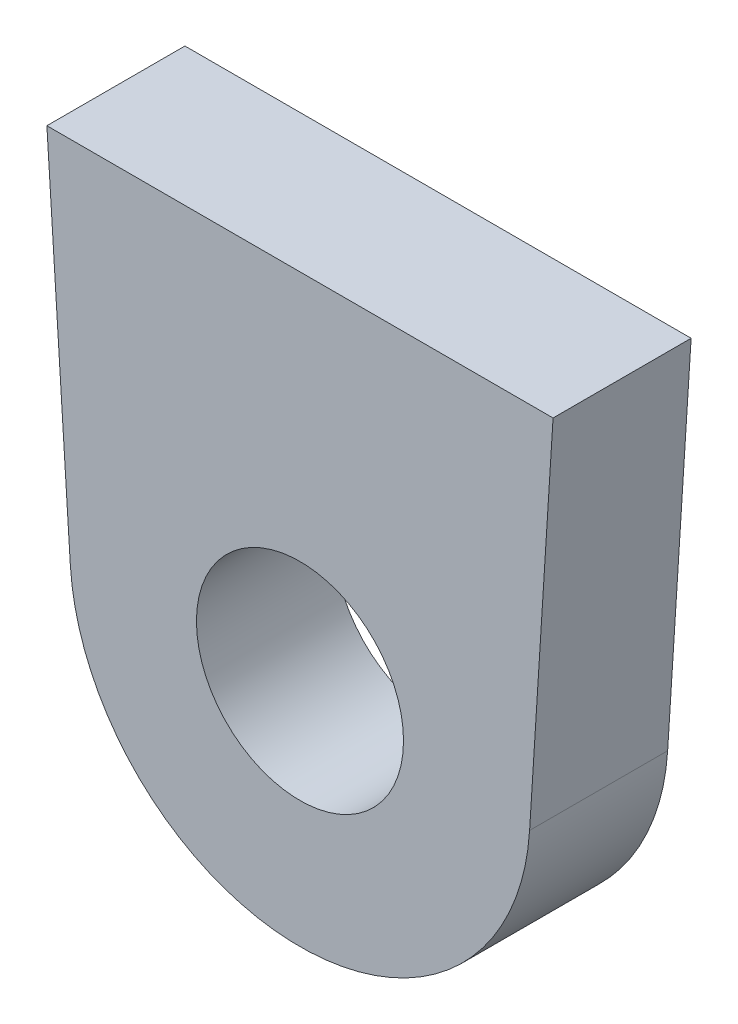
ISO-10303-21;
HEADER;
FILE_DESCRIPTION(('STEP AP214'),'2;1');
FILE_NAME('part.step','',(''),(''),'','','');
FILE_SCHEMA(('AUTOMOTIVE_DESIGN { 1 0 10303 214 1 1 1 1 }'));
ENDSEC;
DATA;
#1=APPLICATION_CONTEXT('core data for automotive mechanical design processes');
#2=APPLICATION_PROTOCOL_DEFINITION('international standard','automotive_design',2000,#1);
#3=PRODUCT_CONTEXT('',#1,'mechanical');
#4=PRODUCT('Part','Part','',(#3));
#5=PRODUCT_RELATED_PRODUCT_CATEGORY('part','',(#4));
#6=PRODUCT_DEFINITION_FORMATION('','',#4);
#7=PRODUCT_DEFINITION_CONTEXT('part definition',#1,'design');
#8=PRODUCT_DEFINITION('design','',#6,#7);
#9=PRODUCT_DEFINITION_SHAPE('','',#8);
#10=(LENGTH_UNIT() NAMED_UNIT(*) SI_UNIT(.MILLI.,.METRE.));
#11=(NAMED_UNIT(*) PLANE_ANGLE_UNIT() SI_UNIT($,.RADIAN.));
#12=(NAMED_UNIT(*) SI_UNIT($,.STERADIAN.) SOLID_ANGLE_UNIT());
#13=UNCERTAINTY_MEASURE_WITH_UNIT(LENGTH_MEASURE(1.E-05),#10,'distance_accuracy_value','');
#14=(GEOMETRIC_REPRESENTATION_CONTEXT(3) GLOBAL_UNCERTAINTY_ASSIGNED_CONTEXT((#13)) GLOBAL_UNIT_ASSIGNED_CONTEXT((#10,
#11,#12)) REPRESENTATION_CONTEXT('',''));
#15=CARTESIAN_POINT('',(0.,0.,0.));
#16=DIRECTION('',(0.,0.,1.));
#17=DIRECTION('',(1.,0.,0.));
#18=AXIS2_PLACEMENT_3D('',#15,#16,#17);
#19=CARTESIAN_POINT('',(0.,0.,30.));
#20=DIRECTION('',(0.,0.,1.));
#21=DIRECTION('',(1.,0.,0.));
#22=AXIS2_PLACEMENT_3D('',#19,#20,#21);
#23=PLANE('',#22);
#24=DIRECTION('',(0.0634938026632661,-0.997982232819482,0.));
#25=VECTOR('',#24,1.);
#26=CARTESIAN_POINT('',(-55.,77.,30.));
#27=LINE('',#26,#25);
#28=CARTESIAN_POINT('',(-55.,77.,30.));
#29=VERTEX_POINT('',#28);
#30=CARTESIAN_POINT('',(-49.8991116409741,-3.17469013316329,30.));
#31=VERTEX_POINT('',#30);
#32=EDGE_CURVE('E87',#29,#31,#27,.T.);
#33=ORIENTED_EDGE('',*,*,#32,.T.);
#34=CARTESIAN_POINT('',(0.,0.,30.));
#35=DIRECTION('',(0.,0.,1.));
#36=DIRECTION('',(1.,0.,0.));
#37=AXIS2_PLACEMENT_3D('',#34,#35,#36);
#38=CIRCLE('',#37,50.);
#39=CARTESIAN_POINT('',(49.8991116409741,-3.17469013316331,30.));
#40=VERTEX_POINT('',#39);
#41=EDGE_CURVE('E82',#31,#40,#38,.T.);
#42=ORIENTED_EDGE('',*,*,#41,.T.);
#43=DIRECTION('',(0.0634938026632661,0.997982232819482,0.));
#44=VECTOR('',#43,1.);
#45=CARTESIAN_POINT('',(55.,77.,30.));
#46=LINE('',#45,#44);
#47=CARTESIAN_POINT('',(55.,77.,30.));
#48=VERTEX_POINT('',#47);
#49=EDGE_CURVE('E85',#40,#48,#46,.T.);
#50=ORIENTED_EDGE('',*,*,#49,.T.);
#51=DIRECTION('',(-1.,0.,0.));
#52=VECTOR('',#51,1.);
#53=CARTESIAN_POINT('',(-55.,77.,30.));
#54=LINE('',#53,#52);
#55=EDGE_CURVE('E52',#48,#29,#54,.T.);
#56=ORIENTED_EDGE('',*,*,#55,.T.);
#57=EDGE_LOOP('',(#33,#42,#50,#56));
#58=FACE_BOUND('',#57,.T.);
#59=CARTESIAN_POINT('',(0.,0.,30.));
#60=DIRECTION('',(0.,0.,1.));
#61=DIRECTION('',(1.,0.,0.));
#62=AXIS2_PLACEMENT_3D('',#59,#60,#61);
#63=CIRCLE('',#62,22.5);
#64=CARTESIAN_POINT('',(22.5,0.,30.));
#65=VERTEX_POINT('',#64);
#66=EDGE_CURVE('E102',#65,#65,#63,.T.);
#67=ORIENTED_EDGE('',*,*,#66,.F.);
#68=EDGE_LOOP('',(#67));
#69=FACE_BOUND('',#68,.T.);
#70=ADVANCED_FACE('F35',(#58,#69),#23,.T.);
#71=CARTESIAN_POINT('',(0.,0.,0.));
#72=DIRECTION('',(0.,0.,1.));
#73=DIRECTION('',(1.,0.,0.));
#74=AXIS2_PLACEMENT_3D('',#71,#72,#73);
#75=PLANE('',#74);
#76=DIRECTION('',(0.0634938026632661,-0.997982232819482,0.));
#77=VECTOR('',#76,1.);
#78=CARTESIAN_POINT('',(-55.,77.,0.));
#79=LINE('',#78,#77);
#80=CARTESIAN_POINT('',(-55.,77.,0.));
#81=VERTEX_POINT('',#80);
#82=CARTESIAN_POINT('',(-49.8991116409741,-3.17469013316329,0.));
#83=VERTEX_POINT('',#82);
#84=EDGE_CURVE('E99',#81,#83,#79,.T.);
#85=ORIENTED_EDGE('',*,*,#84,.F.);
#86=DIRECTION('',(-1.,0.,0.));
#87=VECTOR('',#86,1.);
#88=CARTESIAN_POINT('',(-55.,77.,0.));
#89=LINE('',#88,#87);
#90=CARTESIAN_POINT('',(55.,77.,0.));
#91=VERTEX_POINT('',#90);
#92=EDGE_CURVE('E75',#91,#81,#89,.T.);
#93=ORIENTED_EDGE('',*,*,#92,.F.);
#94=DIRECTION('',(0.0634938026632661,0.997982232819482,0.));
#95=VECTOR('',#94,1.);
#96=CARTESIAN_POINT('',(55.,77.,0.));
#97=LINE('',#96,#95);
#98=CARTESIAN_POINT('',(49.8991116409741,-3.17469013316331,0.));
#99=VERTEX_POINT('',#98);
#100=EDGE_CURVE('E69',#99,#91,#97,.T.);
#101=ORIENTED_EDGE('',*,*,#100,.F.);
#102=CARTESIAN_POINT('',(0.,0.,0.));
#103=DIRECTION('',(0.,0.,1.));
#104=DIRECTION('',(1.,0.,0.));
#105=AXIS2_PLACEMENT_3D('',#102,#103,#104);
#106=CIRCLE('',#105,50.);
#107=EDGE_CURVE('E91',#83,#99,#106,.T.);
#108=ORIENTED_EDGE('',*,*,#107,.F.);
#109=EDGE_LOOP('',(#85,#93,#101,#108));
#110=FACE_BOUND('',#109,.T.);
#111=CARTESIAN_POINT('',(0.,0.,0.));
#112=DIRECTION('',(0.,0.,1.));
#113=DIRECTION('',(1.,0.,0.));
#114=AXIS2_PLACEMENT_3D('',#111,#112,#113);
#115=CIRCLE('',#114,22.5);
#116=CARTESIAN_POINT('',(22.5,0.,0.));
#117=VERTEX_POINT('',#116);
#118=EDGE_CURVE('E114',#117,#117,#115,.T.);
#119=ORIENTED_EDGE('',*,*,#118,.T.);
#120=EDGE_LOOP('',(#119));
#121=FACE_BOUND('',#120,.T.);
#122=ADVANCED_FACE('F110',(#110,#121),#75,.F.);
#123=CARTESIAN_POINT('',(-55.,77.,30.));
#124=DIRECTION('',(0.997982232819482,0.0634938026632661,0.));
#125=DIRECTION('',(-0.0634938026632661,0.997982232819482,0.));
#126=AXIS2_PLACEMENT_3D('',#123,#124,#125);
#127=PLANE('',#126);
#128=ORIENTED_EDGE('',*,*,#84,.T.);
#129=DIRECTION('',(0.,0.,-1.));
#130=VECTOR('',#129,1.);
#131=CARTESIAN_POINT('',(-49.8991116409741,-3.17469013316329,30.));
#132=LINE('',#131,#130);
#133=EDGE_CURVE('E11',#31,#83,#132,.T.);
#134=ORIENTED_EDGE('',*,*,#133,.F.);
#135=ORIENTED_EDGE('',*,*,#32,.F.);
#136=DIRECTION('',(0.,0.,-1.));
#137=VECTOR('',#136,1.);
#138=CARTESIAN_POINT('',(-55.,77.,30.));
#139=LINE('',#138,#137);
#140=EDGE_CURVE('E95',#29,#81,#139,.T.);
#141=ORIENTED_EDGE('',*,*,#140,.T.);
#142=EDGE_LOOP('',(#128,#134,#135,#141));
#143=FACE_BOUND('',#142,.T.);
#144=ADVANCED_FACE('F37',(#143),#127,.F.);
#145=CARTESIAN_POINT('',(0.,0.,30.));
#146=DIRECTION('',(0.,0.,-1.));
#147=DIRECTION('',(-1.,0.,0.));
#148=AXIS2_PLACEMENT_3D('',#145,#146,#147);
#149=CYLINDRICAL_SURFACE('',#148,50.);
#150=ORIENTED_EDGE('',*,*,#107,.T.);
#151=DIRECTION('',(0.,0.,-1.));
#152=VECTOR('',#151,1.);
#153=CARTESIAN_POINT('',(49.8991116409741,-3.17469013316331,30.));
#154=LINE('',#153,#152);
#155=EDGE_CURVE('E44',#40,#99,#154,.T.);
#156=ORIENTED_EDGE('',*,*,#155,.F.);
#157=ORIENTED_EDGE('',*,*,#41,.F.);
#158=ORIENTED_EDGE('',*,*,#133,.T.);
#159=EDGE_LOOP('',(#150,#156,#157,#158));
#160=FACE_BOUND('',#159,.T.);
#161=ADVANCED_FACE('F90',(#160),#149,.T.);
#162=CARTESIAN_POINT('',(55.,77.,30.));
#163=DIRECTION('',(-0.997982232819482,0.0634938026632661,0.));
#164=DIRECTION('',(-0.0634938026632661,-0.997982232819482,0.));
#165=AXIS2_PLACEMENT_3D('',#162,#163,#164);
#166=PLANE('',#165);
#167=ORIENTED_EDGE('',*,*,#100,.T.);
#168=DIRECTION('',(0.,0.,-1.));
#169=VECTOR('',#168,1.);
#170=CARTESIAN_POINT('',(55.,77.,30.));
#171=LINE('',#170,#169);
#172=EDGE_CURVE('E92',#48,#91,#171,.T.);
#173=ORIENTED_EDGE('',*,*,#172,.F.);
#174=ORIENTED_EDGE('',*,*,#49,.F.);
#175=ORIENTED_EDGE('',*,*,#155,.T.);
#176=EDGE_LOOP('',(#167,#173,#174,#175));
#177=FACE_BOUND('',#176,.T.);
#178=ADVANCED_FACE('F93',(#177),#166,.F.);
#179=CARTESIAN_POINT('',(-55.,77.,30.));
#180=DIRECTION('',(0.,-1.,0.));
#181=DIRECTION('',(0.,0.,-1.));
#182=AXIS2_PLACEMENT_3D('',#179,#180,#181);
#183=PLANE('',#182);
#184=ORIENTED_EDGE('',*,*,#92,.T.);
#185=ORIENTED_EDGE('',*,*,#140,.F.);
#186=ORIENTED_EDGE('',*,*,#55,.F.);
#187=ORIENTED_EDGE('',*,*,#172,.T.);
#188=EDGE_LOOP('',(#184,#185,#186,#187));
#189=FACE_BOUND('',#188,.T.);
#190=ADVANCED_FACE('F107',(#189),#183,.F.);
#191=CARTESIAN_POINT('',(0.,0.,30.));
#192=DIRECTION('',(0.,0.,-1.));
#193=DIRECTION('',(-1.,0.,0.));
#194=AXIS2_PLACEMENT_3D('',#191,#192,#193);
#195=CYLINDRICAL_SURFACE('',#194,22.5);
#196=ORIENTED_EDGE('',*,*,#66,.T.);
#197=EDGE_LOOP('',(#196));
#198=FACE_BOUND('',#197,.T.);
#199=ORIENTED_EDGE('',*,*,#118,.F.);
#200=EDGE_LOOP('',(#199));
#201=FACE_BOUND('',#200,.T.);
#202=ADVANCED_FACE('F120',(#198,#201),#195,.F.);
#203=CLOSED_SHELL('',(#70,#122,#144,#161,#178,#190,#202));
#204=MANIFOLD_SOLID_BREP('B2',#203);
#205=ADVANCED_BREP_SHAPE_REPRESENTATION('',(#18,#204),#14);
#206=SHAPE_DEFINITION_REPRESENTATION(#9,#205);
ENDSEC;
END-ISO-10303-21;
